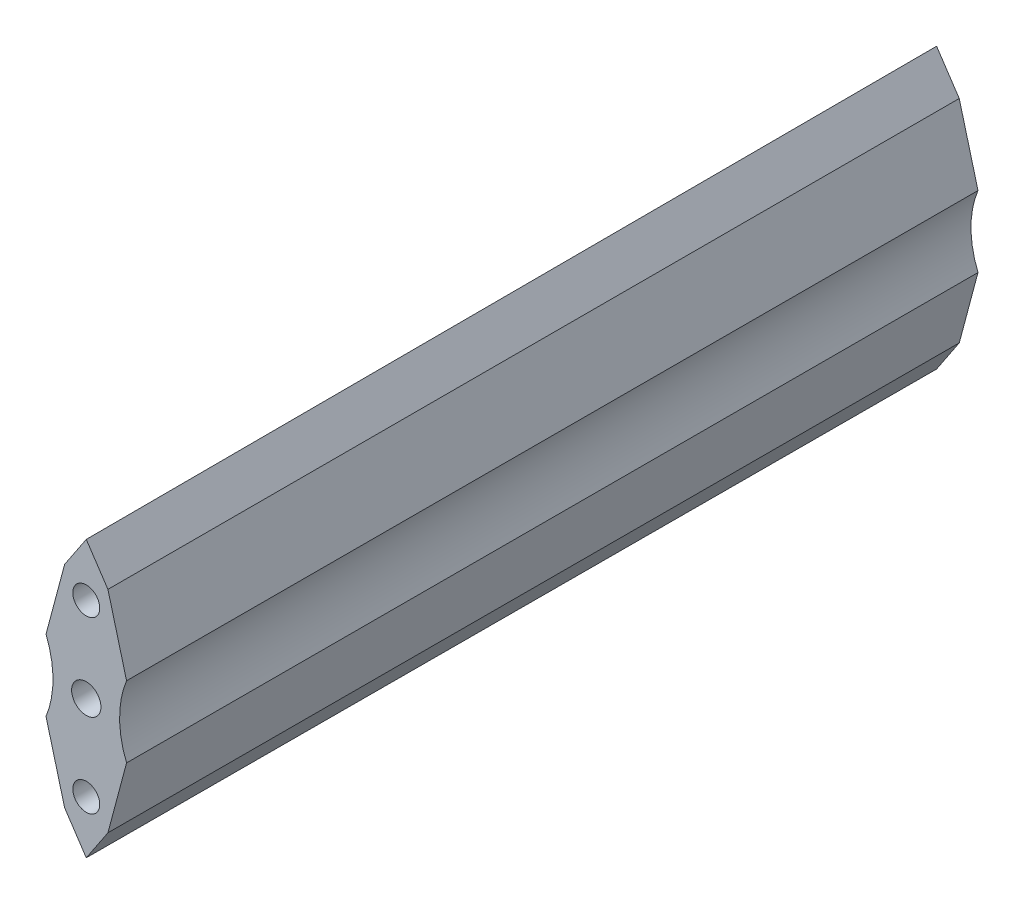
ISO-10303-21;
HEADER;
FILE_DESCRIPTION(('STEP AP214'),'2;1');
FILE_NAME('part.step','',(''),(''),'','','');
FILE_SCHEMA(('AUTOMOTIVE_DESIGN { 1 0 10303 214 1 1 1 1 }'));
ENDSEC;
DATA;
#1=APPLICATION_CONTEXT('core data for automotive mechanical design processes');
#2=APPLICATION_PROTOCOL_DEFINITION('international standard','automotive_design',2000,#1);
#3=PRODUCT_CONTEXT('',#1,'mechanical');
#4=PRODUCT('Part','Part','',(#3));
#5=PRODUCT_RELATED_PRODUCT_CATEGORY('part','',(#4));
#6=PRODUCT_DEFINITION_FORMATION('','',#4);
#7=PRODUCT_DEFINITION_CONTEXT('part definition',#1,'design');
#8=PRODUCT_DEFINITION('design','',#6,#7);
#9=PRODUCT_DEFINITION_SHAPE('','',#8);
#10=(LENGTH_UNIT() NAMED_UNIT(*) SI_UNIT(.MILLI.,.METRE.));
#11=(NAMED_UNIT(*) PLANE_ANGLE_UNIT() SI_UNIT($,.RADIAN.));
#12=(NAMED_UNIT(*) SI_UNIT($,.STERADIAN.) SOLID_ANGLE_UNIT());
#13=UNCERTAINTY_MEASURE_WITH_UNIT(LENGTH_MEASURE(1.E-05),#10,'distance_accuracy_value','');
#14=(GEOMETRIC_REPRESENTATION_CONTEXT(3) GLOBAL_UNCERTAINTY_ASSIGNED_CONTEXT((#13)) GLOBAL_UNIT_ASSIGNED_CONTEXT((#10,
#11,#12)) REPRESENTATION_CONTEXT('',''));
#15=CARTESIAN_POINT('',(0.,0.,0.));
#16=DIRECTION('',(0.,0.,1.));
#17=DIRECTION('',(1.,0.,0.));
#18=AXIS2_PLACEMENT_3D('',#15,#16,#17);
#19=CARTESIAN_POINT('',(0.,0.,709.));
#20=DIRECTION('',(0.,0.,-1.));
#21=DIRECTION('',(-1.,0.,0.));
#22=AXIS2_PLACEMENT_3D('',#19,#20,#21);
#23=CYLINDRICAL_SURFACE('',#22,3.1);
#24=CARTESIAN_POINT('',(0.,0.,360.));
#25=DIRECTION('',(0.,0.,-1.));
#26=DIRECTION('',(-1.,0.,0.));
#27=AXIS2_PLACEMENT_3D('',#24,#25,#26);
#28=CIRCLE('',#27,3.1);
#29=CARTESIAN_POINT('',(-3.1,0.,360.));
#30=VERTEX_POINT('',#29);
#31=EDGE_CURVE('E514',#30,#30,#28,.F.);
#32=ORIENTED_EDGE('',*,*,#31,.T.);
#33=EDGE_LOOP('',(#32));
#34=FACE_BOUND('',#33,.T.);
#35=CARTESIAN_POINT('',(0.,0.,180.));
#36=DIRECTION('',(0.,0.,-1.));
#37=DIRECTION('',(-1.,0.,0.));
#38=AXIS2_PLACEMENT_3D('',#35,#36,#37);
#39=CIRCLE('',#38,3.1);
#40=CARTESIAN_POINT('',(-3.1,0.,180.));
#41=VERTEX_POINT('',#40);
#42=EDGE_CURVE('E372',#41,#41,#39,.F.);
#43=ORIENTED_EDGE('',*,*,#42,.F.);
#44=EDGE_LOOP('',(#43));
#45=FACE_BOUND('',#44,.T.);
#46=ADVANCED_FACE('F273',(#34,#45),#23,.F.);
#47=CARTESIAN_POINT('',(0.,0.,180.));
#48=DIRECTION('',(0.,0.,-1.));
#49=DIRECTION('',(-1.,0.,0.));
#50=AXIS2_PLACEMENT_3D('',#47,#48,#49);
#51=PLANE('',#50);
#52=DIRECTION('',(-0.554700196225229,0.832050294337843,0.));
#53=VECTOR('',#52,1.);
#54=CARTESIAN_POINT('',(4.81278868377399,22.3751924558493,180.));
#55=LINE('',#54,#53);
#56=CARTESIAN_POINT('',(4.7921731963667,22.4061156869602,180.));
#57=VERTEX_POINT('',#56);
#58=CARTESIAN_POINT('',(0.,29.5943754815103,180.));
#59=VERTEX_POINT('',#58);
#60=EDGE_CURVE('E297',#57,#59,#55,.T.);
#61=ORIENTED_EDGE('',*,*,#60,.F.);
#62=DIRECTION('',(-0.257662650560332,0.966234939601246,0.));
#63=VECTOR('',#62,1.);
#64=CARTESIAN_POINT('',(8.78259713858972,7.44202590362392,180.));
#65=LINE('',#64,#63);
#66=CARTESIAN_POINT('',(8.76316273445221,7.5149049191396,180.));
#67=VERTEX_POINT('',#66);
#68=EDGE_CURVE('E365',#67,#57,#65,.T.);
#69=ORIENTED_EDGE('',*,*,#68,.F.);
#70=CARTESIAN_POINT('',(8.7631627344522,-7.5149049191396,180.));
#71=CARTESIAN_POINT('',(8.63923339095012,-7.21425134620902,180.));
#72=CARTESIAN_POINT('',(8.52275894068814,-6.91058980201929,180.));
#73=CARTESIAN_POINT('',(8.30498406162214,-6.29794820535352,180.));
#74=CARTESIAN_POINT('',(8.20368032971688,-5.98896932699576,180.));
#75=CARTESIAN_POINT('',(7.92258235898886,-5.05402957545108,180.));
#76=CARTESIAN_POINT('',(7.76595055436117,-4.42091289499538,180.));
#77=CARTESIAN_POINT('',(7.53474250876535,-3.2378208199603,180.));
#78=CARTESIAN_POINT('',(7.45141583401843,-2.68951778522594,180.));
#79=CARTESIAN_POINT('',(7.33120222327961,-1.58760424941537,180.));
#80=CARTESIAN_POINT('',(7.29433084524245,-1.0339920327966,180.));
#81=CARTESIAN_POINT('',(7.26734570633331,0.0745714171011724,180.));
#82=CARTESIAN_POINT('',(7.27725091510698,0.629523102384922,180.));
#83=CARTESIAN_POINT('',(7.34379375611045,1.73651709336312,180.));
#84=CARTESIAN_POINT('',(7.40041924236144,2.28856011769436,180.));
#85=CARTESIAN_POINT('',(7.53853446415461,3.23853418696265,180.));
#86=CARTESIAN_POINT('',(7.60927296380011,3.63806448409499,180.));
#87=CARTESIAN_POINT('',(7.77524246432016,4.43195989402485,180.));
#88=CARTESIAN_POINT('',(7.87046948111335,4.82632583606289,180.));
#89=CARTESIAN_POINT('',(8.08490097762384,5.60784614959951,180.));
#90=CARTESIAN_POINT('',(8.20406952093394,5.99501039045156,180.));
#91=CARTESIAN_POINT('',(8.46602216495859,6.76133970606915,180.));
#92=CARTESIAN_POINT('',(8.6088103198909,7.14050339494983,180.));
#93=CARTESIAN_POINT('',(8.7631627344522,7.5149049191396,180.));
#94=B_SPLINE_CURVE_WITH_KNOTS('',3,(#70,#71,#72,#73,#74,#75,#76,#77,#78,#79,#80,#81,#82,#83,#84,
#85,#86,#87,#88,#89,#90,#91,#92,#93),.UNSPECIFIED.,.F.,.F.,(4,2,2,2,2,2,2,2,2,2,2,4),(0.,
0.975362118039466,1.95051156199706,3.90354780946154,5.56549676604627,7.2280021642317,
8.89118182807099,10.5539292474261,11.7704418116476,12.9867565843028,14.2012591194413,
15.4159703361136),.UNSPECIFIED.);
#95=CARTESIAN_POINT('',(8.7631627344522,-7.5149049191396,180.));
#96=VERTEX_POINT('',#95);
#97=EDGE_CURVE('E465',#96,#67,#94,.T.);
#98=ORIENTED_EDGE('',*,*,#97,.F.);
#99=DIRECTION('',(0.257662650560332,0.966234939601246,0.));
#100=VECTOR('',#99,1.);
#101=CARTESIAN_POINT('',(4.78259713858972,-22.4420259036239,180.));
#102=LINE('',#101,#100);
#103=CARTESIAN_POINT('',(4.7921731963667,-22.4061156869603,180.));
#104=VERTEX_POINT('',#103);
#105=EDGE_CURVE('E427',#104,#96,#102,.T.);
#106=ORIENTED_EDGE('',*,*,#105,.F.);
#107=DIRECTION('',(0.554700196225229,0.832050294337843,0.));
#108=VECTOR('',#107,1.);
#109=CARTESIAN_POINT('',(-0.187211316226013,-29.8751924558493,180.));
#110=LINE('',#109,#108);
#111=CARTESIAN_POINT('',(0.,-29.5943754815103,180.));
#112=VERTEX_POINT('',#111);
#113=EDGE_CURVE('E425',#112,#104,#110,.T.);
#114=ORIENTED_EDGE('',*,*,#113,.F.);
#115=DIRECTION('',(0.554700196225229,-0.832050294337843,0.));
#116=VECTOR('',#115,1.);
#117=CARTESIAN_POINT('',(-4.81278868377398,-22.3751924558493,180.));
#118=LINE('',#117,#116);
#119=CARTESIAN_POINT('',(-4.7921731963667,-22.4061156869603,180.));
#120=VERTEX_POINT('',#119);
#121=EDGE_CURVE('E503',#120,#112,#118,.T.);
#122=ORIENTED_EDGE('',*,*,#121,.F.);
#123=DIRECTION('',(0.257662650560333,-0.966234939601246,0.));
#124=VECTOR('',#123,1.);
#125=CARTESIAN_POINT('',(-8.78259713858972,-7.44202590362393,180.));
#126=LINE('',#125,#124);
#127=CARTESIAN_POINT('',(-8.76316273445221,-7.5149049191396,180.));
#128=VERTEX_POINT('',#127);
#129=EDGE_CURVE('E479',#128,#120,#126,.T.);
#130=ORIENTED_EDGE('',*,*,#129,.F.);
#131=CARTESIAN_POINT('',(-8.7631627344522,7.5149049191396,180.));
#132=CARTESIAN_POINT('',(-8.63923339095012,7.21425134620903,180.));
#133=CARTESIAN_POINT('',(-8.52275894068814,6.9105898020193,180.));
#134=CARTESIAN_POINT('',(-8.30498406162214,6.29794820535353,180.));
#135=CARTESIAN_POINT('',(-8.20368032971687,5.98896932699577,180.));
#136=CARTESIAN_POINT('',(-7.92258235898886,5.0540295754511,180.));
#137=CARTESIAN_POINT('',(-7.76595055436118,4.4209128949954,180.));
#138=CARTESIAN_POINT('',(-7.53474250876537,3.23782081996032,180.));
#139=CARTESIAN_POINT('',(-7.45141583401843,2.68951778522596,180.));
#140=CARTESIAN_POINT('',(-7.33120222327961,1.5876042494154,180.));
#141=CARTESIAN_POINT('',(-7.29433084524245,1.03399203279663,180.));
#142=CARTESIAN_POINT('',(-7.26734570633331,-0.0745714171011476,180.));
#143=CARTESIAN_POINT('',(-7.27725091510697,-0.629523102384897,180.));
#144=CARTESIAN_POINT('',(-7.34379375611045,-1.73651709336309,180.));
#145=CARTESIAN_POINT('',(-7.40041924236143,-2.28856011769433,180.));
#146=CARTESIAN_POINT('',(-7.53853446415461,-3.23853418696262,180.));
#147=CARTESIAN_POINT('',(-7.60927296380011,-3.63806448409497,180.));
#148=CARTESIAN_POINT('',(-7.77524246432016,-4.43195989402483,180.));
#149=CARTESIAN_POINT('',(-7.87046948111335,-4.82632583606287,180.));
#150=CARTESIAN_POINT('',(-8.08490097762383,-5.6078461495995,180.));
#151=CARTESIAN_POINT('',(-8.20406952093394,-5.99501039045156,180.));
#152=CARTESIAN_POINT('',(-8.46602216495859,-6.76133970606914,180.));
#153=CARTESIAN_POINT('',(-8.6088103198909,-7.14050339494983,180.));
#154=CARTESIAN_POINT('',(-8.76316273445221,-7.5149049191396,180.));
#155=B_SPLINE_CURVE_WITH_KNOTS('',3,(#131,#132,#133,#134,#135,#136,#137,#138,#139,#140,#141,
#142,#143,#144,#145,#146,#147,#148,#149,#150,#151,#152,#153,#154),.UNSPECIFIED.,.F.,.F.,(4,2,2,
2,2,2,2,2,2,2,2,4),(0.,0.975362118039461,1.95051156199705,3.90354780946153,5.56549676604625,
7.22800216423168,8.89118182807097,10.5539292474261,11.7704418116476,12.9867565843028,
14.2012591194413,15.4159703361136),.UNSPECIFIED.);
#156=CARTESIAN_POINT('',(-8.7631627344522,7.5149049191396,180.));
#157=VERTEX_POINT('',#156);
#158=EDGE_CURVE('E472',#157,#128,#155,.T.);
#159=ORIENTED_EDGE('',*,*,#158,.F.);
#160=DIRECTION('',(-0.257662650560333,-0.966234939601246,0.));
#161=VECTOR('',#160,1.);
#162=CARTESIAN_POINT('',(-4.78259713858972,22.4420259036239,180.));
#163=LINE('',#162,#161);
#164=CARTESIAN_POINT('',(-4.7921731963667,22.4061156869603,180.));
#165=VERTEX_POINT('',#164);
#166=EDGE_CURVE('E481',#165,#157,#163,.T.);
#167=ORIENTED_EDGE('',*,*,#166,.F.);
#168=DIRECTION('',(-0.554700196225229,-0.832050294337843,0.));
#169=VECTOR('',#168,1.);
#170=CARTESIAN_POINT('',(0.18721131622602,29.8751924558493,180.));
#171=LINE('',#170,#169);
#172=EDGE_CURVE('E408',#59,#165,#171,.T.);
#173=ORIENTED_EDGE('',*,*,#172,.F.);
#174=EDGE_LOOP('',(#61,#69,#98,#106,#114,#122,#130,#159,#167,#173));
#175=FACE_BOUND('',#174,.T.);
#176=ORIENTED_EDGE('',*,*,#42,.T.);
#177=EDGE_LOOP('',(#176));
#178=FACE_BOUND('',#177,.T.);
#179=CARTESIAN_POINT('',(0.,-18.,180.));
#180=DIRECTION('',(0.,0.,-1.));
#181=DIRECTION('',(-1.,0.,0.));
#182=AXIS2_PLACEMENT_3D('',#179,#180,#181);
#183=CIRCLE('',#182,2.85);
#184=CARTESIAN_POINT('',(-2.85,-18.,180.));
#185=VERTEX_POINT('',#184);
#186=EDGE_CURVE('E509',#185,#185,#183,.F.);
#187=ORIENTED_EDGE('',*,*,#186,.T.);
#188=EDGE_LOOP('',(#187));
#189=FACE_BOUND('',#188,.T.);
#190=CARTESIAN_POINT('',(0.,18.,180.));
#191=DIRECTION('',(0.,0.,-1.));
#192=DIRECTION('',(-1.,0.,0.));
#193=AXIS2_PLACEMENT_3D('',#190,#191,#192);
#194=CIRCLE('',#193,2.85);
#195=CARTESIAN_POINT('',(-2.85,18.,180.));
#196=VERTEX_POINT('',#195);
#197=EDGE_CURVE('E507',#196,#196,#194,.F.);
#198=ORIENTED_EDGE('',*,*,#197,.T.);
#199=EDGE_LOOP('',(#198));
#200=FACE_BOUND('',#199,.T.);
#201=ADVANCED_FACE('F456',(#175,#178,#189,#200),#51,.T.);
#202=CARTESIAN_POINT('',(0.,-18.,795.));
#203=DIRECTION('',(0.,0.,-1.));
#204=DIRECTION('',(-1.,0.,0.));
#205=AXIS2_PLACEMENT_3D('',#202,#203,#204);
#206=CYLINDRICAL_SURFACE('',#205,2.85);
#207=CARTESIAN_POINT('',(0.,-18.,360.));
#208=DIRECTION('',(0.,0.,-1.));
#209=DIRECTION('',(-1.,0.,0.));
#210=AXIS2_PLACEMENT_3D('',#207,#208,#209);
#211=CIRCLE('',#210,2.85);
#212=CARTESIAN_POINT('',(-2.85,-18.,360.));
#213=VERTEX_POINT('',#212);
#214=EDGE_CURVE('E517',#213,#213,#211,.F.);
#215=ORIENTED_EDGE('',*,*,#214,.T.);
#216=EDGE_LOOP('',(#215));
#217=FACE_BOUND('',#216,.T.);
#218=ORIENTED_EDGE('',*,*,#186,.F.);
#219=EDGE_LOOP('',(#218));
#220=FACE_BOUND('',#219,.T.);
#221=ADVANCED_FACE('F461',(#217,#220),#206,.F.);
#222=CARTESIAN_POINT('',(0.,18.,795.));
#223=DIRECTION('',(0.,0.,-1.));
#224=DIRECTION('',(-1.,0.,0.));
#225=AXIS2_PLACEMENT_3D('',#222,#223,#224);
#226=CYLINDRICAL_SURFACE('',#225,2.85);
#227=CARTESIAN_POINT('',(0.,18.,360.));
#228=DIRECTION('',(0.,0.,-1.));
#229=DIRECTION('',(-1.,0.,0.));
#230=AXIS2_PLACEMENT_3D('',#227,#228,#229);
#231=CIRCLE('',#230,2.85);
#232=CARTESIAN_POINT('',(-2.85,18.,360.));
#233=VERTEX_POINT('',#232);
#234=EDGE_CURVE('E520',#233,#233,#231,.F.);
#235=ORIENTED_EDGE('',*,*,#234,.T.);
#236=EDGE_LOOP('',(#235));
#237=FACE_BOUND('',#236,.T.);
#238=ORIENTED_EDGE('',*,*,#197,.F.);
#239=EDGE_LOOP('',(#238));
#240=FACE_BOUND('',#239,.T.);
#241=ADVANCED_FACE('F531',(#237,#240),#226,.F.);
#242=CARTESIAN_POINT('',(0.,30.,0.));
#243=DIRECTION('',(-0.832049644299313,0.554699762866209,0.00124999902343864));
#244=DIRECTION('',(-0.554700196225229,-0.832050294337843,0.));
#245=AXIS2_PLACEMENT_3D('',#242,#243,#244);
#246=PLANE('',#245);
#247=DIRECTION('',(-0.554700196225229,-0.832050294337843,0.));
#248=VECTOR('',#247,1.);
#249=CARTESIAN_POINT('',(0.374422632452034,29.7503849116986,360.));
#250=LINE('',#249,#248);
#251=CARTESIAN_POINT('',(0.,29.1887509630206,360.));
#252=VERTEX_POINT('',#251);
#253=CARTESIAN_POINT('',(-4.58434639273339,22.3122313739205,360.));
#254=VERTEX_POINT('',#253);
#255=EDGE_CURVE('E489',#252,#254,#250,.T.);
#256=ORIENTED_EDGE('',*,*,#255,.F.);
#257=DIRECTION('',(0.,0.00225346382548676,-0.99999746094717));
#258=VECTOR('',#257,1.);
#259=CARTESIAN_POINT('',(0.,29.098612181134,400.));
#260=LINE('',#259,#258);
#261=EDGE_CURVE('E277',#252,#59,#260,.T.);
#262=ORIENTED_EDGE('',*,*,#261,.T.);
#263=ORIENTED_EDGE('',*,*,#172,.T.);
#264=DIRECTION('',(0.00115459242688266,-0.000521579098286261,0.999999197435464));
#265=VECTOR('',#264,1.);
#266=CARTESIAN_POINT('',(-4.53816265859266,22.291368193245,400.));
#267=LINE('',#266,#265);
#268=EDGE_CURVE('E386',#165,#254,#267,.T.);
#269=ORIENTED_EDGE('',*,*,#268,.T.);
#270=EDGE_LOOP('',(#256,#262,#263,#269));
#271=FACE_BOUND('',#270,.T.);
#272=ADVANCED_FACE('F488',(#271),#246,.T.);
#273=CARTESIAN_POINT('',(-5.,22.5,0.));
#274=DIRECTION('',(-0.966234184731084,0.257662449261623,0.00124999902343865));
#275=DIRECTION('',(-0.257662650560333,-0.966234939601246,0.));
#276=AXIS2_PLACEMENT_3D('',#273,#274,#275);
#277=PLANE('',#276);
#278=DIRECTION('',(-0.257662650560333,-0.966234939601246,0.));
#279=VECTOR('',#278,1.);
#280=CARTESIAN_POINT('',(-4.56519427717944,22.3840518072479,360.));
#281=LINE('',#280,#279);
#282=CARTESIAN_POINT('',(-8.52632546890441,7.5298098382792,360.));
#283=VERTEX_POINT('',#282);
#284=EDGE_CURVE('E362',#254,#283,#281,.T.);
#285=ORIENTED_EDGE('',*,*,#284,.F.);
#286=ORIENTED_EDGE('',*,*,#268,.F.);
#287=ORIENTED_EDGE('',*,*,#166,.T.);
#288=DIRECTION('',(0.00131576144292263,8.2805034369932E-05,0.999999130957198));
#289=VECTOR('',#288,1.);
#290=CARTESIAN_POINT('',(-8.47369496544935,7.53312204253245,400.));
#291=LINE('',#290,#289);
#292=EDGE_CURVE('E389',#157,#283,#291,.T.);
#293=ORIENTED_EDGE('',*,*,#292,.T.);
#294=EDGE_LOOP('',(#285,#286,#287,#293));
#295=FACE_BOUND('',#294,.T.);
#296=ADVANCED_FACE('F524',(#295),#277,.T.);
#297=CARTESIAN_POINT('',(5.,22.5,0.));
#298=DIRECTION('',(0.832049644299313,0.554699762866209,0.00124999902343864));
#299=DIRECTION('',(-0.554700196225229,0.832050294337843,0.));
#300=AXIS2_PLACEMENT_3D('',#297,#298,#299);
#301=PLANE('',#300);
#302=DIRECTION('',(-0.554700196225229,0.832050294337843,0.));
#303=VECTOR('',#302,1.);
#304=CARTESIAN_POINT('',(4.62557736754797,22.2503849116986,360.));
#305=LINE('',#304,#303);
#306=CARTESIAN_POINT('',(4.5843463927334,22.3122313739205,360.));
#307=VERTEX_POINT('',#306);
#308=EDGE_CURVE('E352',#307,#252,#305,.T.);
#309=ORIENTED_EDGE('',*,*,#308,.F.);
#310=DIRECTION('',(-0.00115459242688266,-0.000521579098286261,0.999999197435464));
#311=VECTOR('',#310,1.);
#312=CARTESIAN_POINT('',(4.53816265859267,22.291368193245,400.));
#313=LINE('',#312,#311);
#314=EDGE_CURVE('E283',#57,#307,#313,.T.);
#315=ORIENTED_EDGE('',*,*,#314,.F.);
#316=ORIENTED_EDGE('',*,*,#60,.T.);
#317=ORIENTED_EDGE('',*,*,#261,.F.);
#318=EDGE_LOOP('',(#309,#315,#316,#317));
#319=FACE_BOUND('',#318,.T.);
#320=ADVANCED_FACE('F361',(#319),#301,.T.);
#321=CARTESIAN_POINT('',(-9.,7.5,0.));
#322=CARTESIAN_POINT('',(-7.94738993089869,7.5662440850649,800.));
#323=CARTESIAN_POINT('',(-8.75325555323637,6.9078133277673,0.));
#324=CARTESIAN_POINT('',(-7.70903785971492,6.96604813310095,800.));
#325=CARTESIAN_POINT('',(-8.31825720304425,5.69906975911781,0.));
#326=CARTESIAN_POINT('',(-7.28909415940078,5.74311601064957,800.000000000001));
#327=CARTESIAN_POINT('',(-7.84760675080053,3.8304786498399,0.));
#328=CARTESIAN_POINT('',(-6.83510364276034,3.85745789019627,799.999999999999));
#329=CARTESIAN_POINT('',(-7.5633644339186,1.92460591348961,0.));
#330=CARTESIAN_POINT('',(-6.56107216414013,1.93737438025298,800.));
#331=CARTESIAN_POINT('',(-7.5,0.641535561585432,0.));
#332=CARTESIAN_POINT('',(-6.5,0.645791677394109,800.));
#333=CARTESIAN_POINT('',(-7.5,-0.641535561585428,0.));
#334=CARTESIAN_POINT('',(-6.5,-0.64579167739411,800.));
#335=CARTESIAN_POINT('',(-7.56336443391862,-1.92460591348961,0.));
#336=CARTESIAN_POINT('',(-6.56107216414012,-1.93737438025299,799.999999999999));
#337=CARTESIAN_POINT('',(-7.84760675080051,-3.83047864983989,0.));
#338=CARTESIAN_POINT('',(-6.83510364276035,-3.85745789019627,800.000000000001));
#339=CARTESIAN_POINT('',(-8.31825720304427,-5.69906975911781,0.));
#340=CARTESIAN_POINT('',(-7.28909415940077,-5.74311601064957,800.));
#341=CARTESIAN_POINT('',(-8.75325555323637,-6.90781332776729,0.));
#342=CARTESIAN_POINT('',(-7.70903785971492,-6.96604813310096,800.));
#343=CARTESIAN_POINT('',(-9.,-7.5,0.));
#344=CARTESIAN_POINT('',(-7.94738993089869,-7.5662440850649,800.));
#345=B_SPLINE_SURFACE_WITH_KNOTS('',3,1,((#321,#322),(#323,#324),(#325,#326),(#327,#328),(#329,
#330),(#331,#332),(#333,#334),(#335,#336),(#337,#338),(#339,#340),(#341,#342),(#343,#344)),
.UNSPECIFIED.,.F.,.F.,.F.,(4,1,1,1,2,1,1,1,4),(2,2),(0.,0.125,0.25,0.375,0.5,0.625,0.75,0.875,
1.),(0.,1.),.UNSPECIFIED.);
#346=CARTESIAN_POINT('',(-8.52632546890441,7.5298098382792,360.));
#347=CARTESIAN_POINT('',(-8.40357068639655,7.22878131431198,360.));
#348=CARTESIAN_POINT('',(-8.28819431094961,6.9248069239241,360.));
#349=CARTESIAN_POINT('',(-8.0724270636938,6.31157209057556,360.));
#350=CARTESIAN_POINT('',(-7.97203677984036,6.00231144074719,360.));
#351=CARTESIAN_POINT('',(-7.69345494716293,5.06671574131332,360.));
#352=CARTESIAN_POINT('',(-7.53818022552716,4.43337091255606,360.));
#353=CARTESIAN_POINT('',(-7.30762890343136,3.2438654582102,360.));
#354=CARTESIAN_POINT('',(-7.2242197770674,2.68924771151613,360.));
#355=CARTESIAN_POINT('',(-7.10437392148102,1.5747157640212,360.));
#356=CARTESIAN_POINT('',(-7.06795326393122,1.01479981697968,360.));
#357=CARTESIAN_POINT('',(-7.04239993433726,-0.106300884457227,360.));
#358=CARTESIAN_POINT('',(-7.05328542480139,-0.667486043486004,360.));
#359=CARTESIAN_POINT('',(-7.12231058573084,-1.78683670556234,360.));
#360=CARTESIAN_POINT('',(-7.18043741996177,-2.34500298742048,360.));
#361=CARTESIAN_POINT('',(-7.32030716237935,-3.29670313530534,360.));
#362=CARTESIAN_POINT('',(-7.39064749303245,-3.69195340251776,360.));
#363=CARTESIAN_POINT('',(-7.55503754445675,-4.47744544549087,360.));
#364=CARTESIAN_POINT('',(-7.64908323942416,-4.86768805987061,360.));
#365=CARTESIAN_POINT('',(-7.86038315439836,-5.64117208221556,360.));
#366=CARTESIAN_POINT('',(-7.97760060347785,-6.0244235451572,360.));
#367=CARTESIAN_POINT('',(-8.2349146438214,-6.78324306617004,360.));
#368=CARTESIAN_POINT('',(-8.37501529153999,-7.15880974867025,360.));
#369=CARTESIAN_POINT('',(-8.52632546890441,-7.5298098382792,360.));
#370=B_SPLINE_CURVE_WITH_KNOTS('',3,(#346,#347,#348,#349,#350,#351,#352,#353,#354,#355,#356,
#357,#358,#359,#360,#361,#362,#363,#364,#365,#366,#367,#368,#369),.UNSPECIFIED.,.F.,.F.,(4,2,2,
2,2,2,2,2,2,2,2,4),(0.,0.975072012490932,1.95018227032989,3.90299636643885,5.58368699524673,
7.26495232579442,8.94686321075683,10.6283172461552,11.8320205944874,13.0355196594192,
14.2371240219002,15.4389416217953),.UNSPECIFIED.);
#371=CARTESIAN_POINT('',(-8.52632546890441,-7.5298098382792,360.));
#372=VERTEX_POINT('',#371);
#373=EDGE_CURVE('E363',#283,#372,#370,.T.);
#374=DIRECTION('',(0.00131576144292262,-8.28050343699494E-05,0.999999130957198));
#375=VECTOR('',#374,1.);
#376=CARTESIAN_POINT('',(-8.47369496544935,-7.53312204253245,400.));
#377=LINE('',#376,#375);
#378=EDGE_CURVE('E392',#128,#372,#377,.T.);
#379=ORIENTED_EDGE('',*,*,#373,.F.);
#380=ORIENTED_EDGE('',*,*,#292,.F.);
#381=ORIENTED_EDGE('',*,*,#158,.T.);
#382=ORIENTED_EDGE('',*,*,#378,.T.);
#383=EDGE_LOOP('',(#379,#380,#381,#382));
#384=FACE_BOUND('',#383,.T.);
#385=ADVANCED_FACE('F446',(#384),#345,.T.);
#386=CARTESIAN_POINT('',(-9.,-7.5,0.));
#387=DIRECTION('',(-0.966234184731084,-0.257662449261623,0.00124999902343865));
#388=DIRECTION('',(0.257662650560333,-0.966234939601246,0.));
#389=AXIS2_PLACEMENT_3D('',#386,#387,#388);
#390=PLANE('',#389);
#391=DIRECTION('',(0.257662650560333,-0.966234939601246,0.));
#392=VECTOR('',#391,1.);
#393=CARTESIAN_POINT('',(-8.56519427717944,-7.38405180724785,360.));
#394=LINE('',#393,#392);
#395=CARTESIAN_POINT('',(-4.58434639273339,-22.3122313739205,360.));
#396=VERTEX_POINT('',#395);
#397=EDGE_CURVE('E439',#372,#396,#394,.T.);
#398=ORIENTED_EDGE('',*,*,#397,.F.);
#399=ORIENTED_EDGE('',*,*,#378,.F.);
#400=ORIENTED_EDGE('',*,*,#129,.T.);
#401=DIRECTION('',(0.00115459242688266,0.000521579098286261,0.999999197435464));
#402=VECTOR('',#401,1.);
#403=CARTESIAN_POINT('',(-4.53816265859266,-22.291368193245,400.));
#404=LINE('',#403,#402);
#405=EDGE_CURVE('E395',#120,#396,#404,.T.);
#406=ORIENTED_EDGE('',*,*,#405,.T.);
#407=EDGE_LOOP('',(#398,#399,#400,#406));
#408=FACE_BOUND('',#407,.T.);
#409=ADVANCED_FACE('F497',(#408),#390,.T.);
#410=CARTESIAN_POINT('',(-5.,-22.5,0.));
#411=DIRECTION('',(-0.832049644299313,-0.554699762866209,0.00124999902343864));
#412=DIRECTION('',(0.554700196225229,-0.832050294337843,0.));
#413=AXIS2_PLACEMENT_3D('',#410,#411,#412);
#414=PLANE('',#413);
#415=DIRECTION('',(0.554700196225229,-0.832050294337843,0.));
#416=VECTOR('',#415,1.);
#417=CARTESIAN_POINT('',(-4.62557736754797,-22.2503849116986,360.));
#418=LINE('',#417,#416);
#419=CARTESIAN_POINT('',(0.,-29.1887509630206,360.));
#420=VERTEX_POINT('',#419);
#421=EDGE_CURVE('E430',#396,#420,#418,.T.);
#422=ORIENTED_EDGE('',*,*,#421,.F.);
#423=ORIENTED_EDGE('',*,*,#405,.F.);
#424=ORIENTED_EDGE('',*,*,#121,.T.);
#425=DIRECTION('',(0.,0.00225346382548676,0.99999746094717));
#426=VECTOR('',#425,1.);
#427=CARTESIAN_POINT('',(0.,-29.098612181134,400.));
#428=LINE('',#427,#426);
#429=EDGE_CURVE('E400',#112,#420,#428,.T.);
#430=ORIENTED_EDGE('',*,*,#429,.T.);
#431=EDGE_LOOP('',(#422,#423,#424,#430));
#432=FACE_BOUND('',#431,.T.);
#433=ADVANCED_FACE('F501',(#432),#414,.T.);
#434=CARTESIAN_POINT('',(0.,-30.,0.));
#435=DIRECTION('',(0.832049644299313,-0.554699762866209,0.00124999902343864));
#436=DIRECTION('',(0.554700196225229,0.832050294337843,0.));
#437=AXIS2_PLACEMENT_3D('',#434,#435,#436);
#438=PLANE('',#437);
#439=DIRECTION('',(0.554700196225229,0.832050294337843,0.));
#440=VECTOR('',#439,1.);
#441=CARTESIAN_POINT('',(-0.374422632452027,-29.7503849116986,360.));
#442=LINE('',#441,#440);
#443=CARTESIAN_POINT('',(4.5843463927334,-22.3122313739205,360.));
#444=VERTEX_POINT('',#443);
#445=EDGE_CURVE('E424',#420,#444,#442,.T.);
#446=ORIENTED_EDGE('',*,*,#445,.F.);
#447=ORIENTED_EDGE('',*,*,#429,.F.);
#448=ORIENTED_EDGE('',*,*,#113,.T.);
#449=DIRECTION('',(-0.00115459242688266,0.000521579098286261,0.999999197435464));
#450=VECTOR('',#449,1.);
#451=CARTESIAN_POINT('',(4.53816265859267,-22.291368193245,400.));
#452=LINE('',#451,#450);
#453=EDGE_CURVE('E404',#104,#444,#452,.T.);
#454=ORIENTED_EDGE('',*,*,#453,.T.);
#455=EDGE_LOOP('',(#446,#447,#448,#454));
#456=FACE_BOUND('',#455,.T.);
#457=ADVANCED_FACE('F422',(#456),#438,.T.);
#458=CARTESIAN_POINT('',(5.,-22.5,0.));
#459=DIRECTION('',(0.966234184731084,-0.257662449261622,0.00124999902343865));
#460=DIRECTION('',(0.257662650560332,0.966234939601246,0.));
#461=AXIS2_PLACEMENT_3D('',#458,#459,#460);
#462=PLANE('',#461);
#463=DIRECTION('',(0.257662650560332,0.966234939601246,0.));
#464=VECTOR('',#463,1.);
#465=CARTESIAN_POINT('',(4.56519427717944,-22.3840518072479,360.));
#466=LINE('',#465,#464);
#467=CARTESIAN_POINT('',(8.52632546890441,-7.5298098382792,360.));
#468=VERTEX_POINT('',#467);
#469=EDGE_CURVE('E428',#444,#468,#466,.T.);
#470=ORIENTED_EDGE('',*,*,#469,.F.);
#471=ORIENTED_EDGE('',*,*,#453,.F.);
#472=ORIENTED_EDGE('',*,*,#105,.T.);
#473=DIRECTION('',(-0.00131576144292263,-8.28050343699494E-05,0.999999130957198));
#474=VECTOR('',#473,1.);
#475=CARTESIAN_POINT('',(8.47369496544935,-7.53312204253245,400.));
#476=LINE('',#475,#474);
#477=EDGE_CURVE('E368',#96,#468,#476,.T.);
#478=ORIENTED_EDGE('',*,*,#477,.T.);
#479=EDGE_LOOP('',(#470,#471,#472,#478));
#480=FACE_BOUND('',#479,.T.);
#481=ADVANCED_FACE('F426',(#480),#462,.T.);
#482=CARTESIAN_POINT('',(9.,-7.5,0.));
#483=CARTESIAN_POINT('',(7.94738993089869,-7.5662440850649,800.));
#484=CARTESIAN_POINT('',(8.75325555323637,-6.90781332776729,0.));
#485=CARTESIAN_POINT('',(7.70903785971492,-6.96604813310095,800.));
#486=CARTESIAN_POINT('',(8.31825720304428,-5.69906975911781,0.));
#487=CARTESIAN_POINT('',(7.28909415940079,-5.74311601064957,800.000000000001));
#488=CARTESIAN_POINT('',(7.8476067508005,-3.83047864983989,0.));
#489=CARTESIAN_POINT('',(6.83510364276033,-3.85745789019627,799.999999999999));
#490=CARTESIAN_POINT('',(7.56336443391863,-1.92460591348961,0.));
#491=CARTESIAN_POINT('',(6.56107216414014,-1.93737438025299,800.000000000001));
#492=CARTESIAN_POINT('',(7.5,-0.64153556158543,0.));
#493=CARTESIAN_POINT('',(6.5,-0.645791677394112,800.));
#494=CARTESIAN_POINT('',(7.5,0.64153556158543,0.));
#495=CARTESIAN_POINT('',(6.5,0.645791677394106,800.));
#496=CARTESIAN_POINT('',(7.56336443391863,1.92460591348961,0.));
#497=CARTESIAN_POINT('',(6.56107216414012,1.93737438025298,800.));
#498=CARTESIAN_POINT('',(7.8476067508005,3.83047864983989,0.));
#499=CARTESIAN_POINT('',(6.83510364276035,3.85745789019627,800.));
#500=CARTESIAN_POINT('',(8.31825720304427,5.69906975911781,0.));
#501=CARTESIAN_POINT('',(7.28909415940077,5.74311601064956,800.));
#502=CARTESIAN_POINT('',(8.75325555323637,6.9078133277673,0.));
#503=CARTESIAN_POINT('',(7.70903785971492,6.96604813310095,800.));
#504=CARTESIAN_POINT('',(9.,7.5,0.));
#505=CARTESIAN_POINT('',(7.94738993089869,7.56624408506489,800.));
#506=B_SPLINE_SURFACE_WITH_KNOTS('',3,1,((#482,#483),(#484,#485),(#486,#487),(#488,#489),(#490,
#491),(#492,#493),(#494,#495),(#496,#497),(#498,#499),(#500,#501),(#502,#503),(#504,#505)),
.UNSPECIFIED.,.F.,.F.,.F.,(4,1,1,1,2,1,1,1,4),(2,2),(0.,0.125,0.25,0.375,0.5,0.625,0.75,0.875,
1.),(0.,1.),.UNSPECIFIED.);
#507=CARTESIAN_POINT('',(8.52632546890441,-7.5298098382792,360.));
#508=CARTESIAN_POINT('',(8.40357068639655,-7.22878131431198,360.));
#509=CARTESIAN_POINT('',(8.28819431094961,-6.92480692392409,360.));
#510=CARTESIAN_POINT('',(8.07242706369381,-6.31157209057555,360.));
#511=CARTESIAN_POINT('',(7.97203677984036,-6.00231144074718,360.));
#512=CARTESIAN_POINT('',(7.69345494716293,-5.06671574131331,360.));
#513=CARTESIAN_POINT('',(7.53818022552715,-4.43337091255604,360.));
#514=CARTESIAN_POINT('',(7.30762890343135,-3.24386545821019,360.));
#515=CARTESIAN_POINT('',(7.2242197770674,-2.68924771151612,360.));
#516=CARTESIAN_POINT('',(7.10437392148103,-1.57471576402119,360.));
#517=CARTESIAN_POINT('',(7.06795326393123,-1.01479981697969,360.));
#518=CARTESIAN_POINT('',(7.04239993433726,0.106300884457215,360.));
#519=CARTESIAN_POINT('',(7.05328542480139,0.667486043485986,360.));
#520=CARTESIAN_POINT('',(7.12231058573083,1.78683670556231,360.));
#521=CARTESIAN_POINT('',(7.18043741996177,2.34500298742044,360.));
#522=CARTESIAN_POINT('',(7.32030716237934,3.29670313530531,360.));
#523=CARTESIAN_POINT('',(7.39064749303244,3.69195340251773,360.));
#524=CARTESIAN_POINT('',(7.55503754445674,4.47744544549085,360.));
#525=CARTESIAN_POINT('',(7.64908323942415,4.86768805987059,360.));
#526=CARTESIAN_POINT('',(7.86038315439835,5.64117208221554,360.));
#527=CARTESIAN_POINT('',(7.97760060347785,6.02442354515719,360.));
#528=CARTESIAN_POINT('',(8.23491464382139,6.78324306617003,360.));
#529=CARTESIAN_POINT('',(8.37501529153998,7.15880974867025,360.));
#530=CARTESIAN_POINT('',(8.52632546890441,7.5298098382792,360.));
#531=B_SPLINE_CURVE_WITH_KNOTS('',3,(#507,#508,#509,#510,#511,#512,#513,#514,#515,#516,#517,
#518,#519,#520,#521,#522,#523,#524,#525,#526,#527,#528,#529,#530),.UNSPECIFIED.,.F.,.F.,(4,2,2,
2,2,2,2,2,2,2,2,4),(0.,0.975072012490937,1.9501822703299,3.90299636643886,5.58368699524673,
7.2649523257944,8.9468632107568,10.6283172461552,11.8320205944874,13.0355196594192,
14.2371240219002,15.4389416217953),.UNSPECIFIED.);
#532=CARTESIAN_POINT('',(8.52632546890441,7.5298098382792,360.));
#533=VERTEX_POINT('',#532);
#534=EDGE_CURVE('E289',#468,#533,#531,.T.);
#535=DIRECTION('',(-0.00131576144292263,8.2805034369932E-05,0.999999130957198));
#536=VECTOR('',#535,1.);
#537=CARTESIAN_POINT('',(8.47369496544934,7.53312204253244,400.));
#538=LINE('',#537,#536);
#539=EDGE_CURVE('E366',#67,#533,#538,.T.);
#540=ORIENTED_EDGE('',*,*,#534,.F.);
#541=ORIENTED_EDGE('',*,*,#477,.F.);
#542=ORIENTED_EDGE('',*,*,#97,.T.);
#543=ORIENTED_EDGE('',*,*,#539,.T.);
#544=EDGE_LOOP('',(#540,#541,#542,#543));
#545=FACE_BOUND('',#544,.T.);
#546=ADVANCED_FACE('F584',(#545),#506,.T.);
#547=CARTESIAN_POINT('',(9.,7.5,0.));
#548=DIRECTION('',(0.966234184731084,0.257662449261622,0.00124999902343865));
#549=DIRECTION('',(-0.257662650560332,0.966234939601246,0.));
#550=AXIS2_PLACEMENT_3D('',#547,#548,#549);
#551=PLANE('',#550);
#552=DIRECTION('',(-0.257662650560332,0.966234939601246,0.));
#553=VECTOR('',#552,1.);
#554=CARTESIAN_POINT('',(8.56519427717944,7.38405180724785,360.));
#555=LINE('',#554,#553);
#556=EDGE_CURVE('E13',#533,#307,#555,.T.);
#557=ORIENTED_EDGE('',*,*,#556,.F.);
#558=ORIENTED_EDGE('',*,*,#539,.F.);
#559=ORIENTED_EDGE('',*,*,#68,.T.);
#560=ORIENTED_EDGE('',*,*,#314,.T.);
#561=EDGE_LOOP('',(#557,#558,#559,#560));
#562=FACE_BOUND('',#561,.T.);
#563=ADVANCED_FACE('F275',(#562),#551,.T.);
#564=CARTESIAN_POINT('',(0.,0.,360.));
#565=DIRECTION('',(0.,0.,-1.));
#566=DIRECTION('',(-1.,0.,0.));
#567=AXIS2_PLACEMENT_3D('',#564,#565,#566);
#568=PLANE('',#567);
#569=ORIENTED_EDGE('',*,*,#214,.F.);
#570=EDGE_LOOP('',(#569));
#571=FACE_BOUND('',#570,.T.);
#572=ORIENTED_EDGE('',*,*,#255,.T.);
#573=ORIENTED_EDGE('',*,*,#284,.T.);
#574=ORIENTED_EDGE('',*,*,#373,.T.);
#575=ORIENTED_EDGE('',*,*,#397,.T.);
#576=ORIENTED_EDGE('',*,*,#421,.T.);
#577=ORIENTED_EDGE('',*,*,#445,.T.);
#578=ORIENTED_EDGE('',*,*,#469,.T.);
#579=ORIENTED_EDGE('',*,*,#534,.T.);
#580=ORIENTED_EDGE('',*,*,#556,.T.);
#581=ORIENTED_EDGE('',*,*,#308,.T.);
#582=EDGE_LOOP('',(#572,#573,#574,#575,#576,#577,#578,#579,#580,#581));
#583=FACE_BOUND('',#582,.T.);
#584=ORIENTED_EDGE('',*,*,#234,.F.);
#585=EDGE_LOOP('',(#584));
#586=FACE_BOUND('',#585,.T.);
#587=ORIENTED_EDGE('',*,*,#31,.F.);
#588=EDGE_LOOP('',(#587));
#589=FACE_BOUND('',#588,.T.);
#590=ADVANCED_FACE('F350',(#571,#583,#586,#589),#568,.F.);
#591=CLOSED_SHELL('',(#46,#201,#221,#241,#272,#296,#320,#385,#409,#433,#457,#481,#546,#563,#590));
#592=MANIFOLD_SOLID_BREP('B2',#591);
#593=ADVANCED_BREP_SHAPE_REPRESENTATION('',(#18,#592),#14);
#594=SHAPE_DEFINITION_REPRESENTATION(#9,#593);
ENDSEC;
END-ISO-10303-21;
